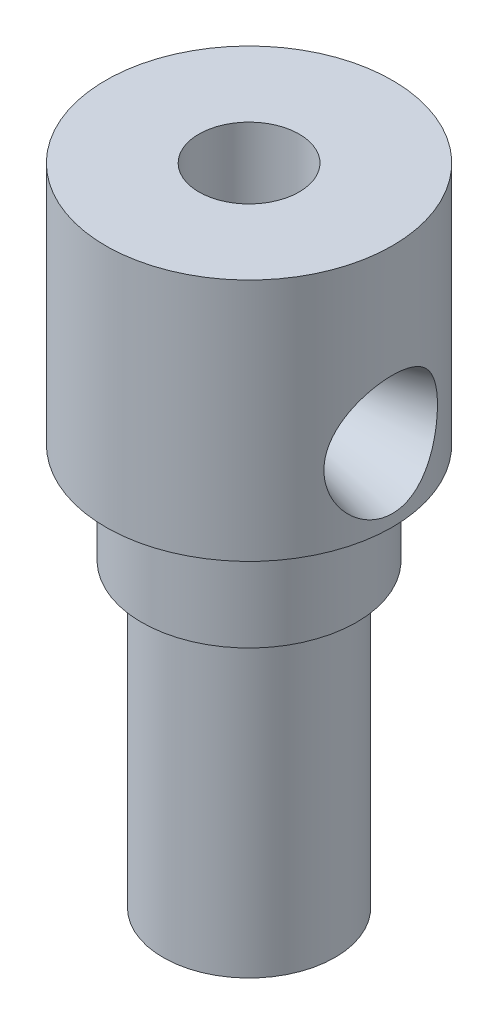
ISO-10303-21;
HEADER;
FILE_DESCRIPTION(('STEP AP214'),'2;1');
FILE_NAME('part.step','',(''),(''),'','','');
FILE_SCHEMA(('AUTOMOTIVE_DESIGN { 1 0 10303 214 1 1 1 1 }'));
ENDSEC;
DATA;
#1=APPLICATION_CONTEXT('core data for automotive mechanical design processes');
#2=APPLICATION_PROTOCOL_DEFINITION('international standard','automotive_design',2000,#1);
#3=PRODUCT_CONTEXT('',#1,'mechanical');
#4=PRODUCT('Part','Part','',(#3));
#5=PRODUCT_RELATED_PRODUCT_CATEGORY('part','',(#4));
#6=PRODUCT_DEFINITION_FORMATION('','',#4);
#7=PRODUCT_DEFINITION_CONTEXT('part definition',#1,'design');
#8=PRODUCT_DEFINITION('design','',#6,#7);
#9=PRODUCT_DEFINITION_SHAPE('','',#8);
#10=(LENGTH_UNIT() NAMED_UNIT(*) SI_UNIT(.MILLI.,.METRE.));
#11=(NAMED_UNIT(*) PLANE_ANGLE_UNIT() SI_UNIT($,.RADIAN.));
#12=(NAMED_UNIT(*) SI_UNIT($,.STERADIAN.) SOLID_ANGLE_UNIT());
#13=UNCERTAINTY_MEASURE_WITH_UNIT(LENGTH_MEASURE(1.E-05),#10,'distance_accuracy_value','');
#14=(GEOMETRIC_REPRESENTATION_CONTEXT(3) GLOBAL_UNCERTAINTY_ASSIGNED_CONTEXT((#13)) GLOBAL_UNIT_ASSIGNED_CONTEXT((#10,
#11,#12)) REPRESENTATION_CONTEXT('',''));
#15=CARTESIAN_POINT('',(0.,0.,0.));
#16=DIRECTION('',(0.,0.,1.));
#17=DIRECTION('',(1.,0.,0.));
#18=AXIS2_PLACEMENT_3D('',#15,#16,#17);
#19=CARTESIAN_POINT('',(3.43024899888577E-12,-1000.,0.));
#20=DIRECTION('',(0.,-1.,0.));
#21=DIRECTION('',(1.,0.,0.));
#22=AXIS2_PLACEMENT_3D('',#19,#20,#21);
#23=CYLINDRICAL_SURFACE('',#22,3.50000000000007);
#24=CARTESIAN_POINT('',(-1.54361204949859E-13,44.9999999999999,0.));
#25=DIRECTION('',(0.,-1.,0.));
#26=DIRECTION('',(1.,0.,0.));
#27=AXIS2_PLACEMENT_3D('',#24,#25,#26);
#28=CIRCLE('',#27,3.50000000000015);
#29=CARTESIAN_POINT('',(3.49999999999999,44.9999999999999,0.));
#30=VERTEX_POINT('',#29);
#31=EDGE_CURVE('E146',#30,#30,#28,.T.);
#32=ORIENTED_EDGE('',*,*,#31,.F.);
#33=EDGE_LOOP('',(#32));
#34=FACE_BOUND('',#33,.T.);
#35=CARTESIAN_POINT('',(0.,0.,0.));
#36=DIRECTION('',(0.,-1.,0.));
#37=DIRECTION('',(1.,0.,0.));
#38=AXIS2_PLACEMENT_3D('',#35,#36,#37);
#39=CIRCLE('',#38,3.5);
#40=CARTESIAN_POINT('',(3.5,0.,0.));
#41=VERTEX_POINT('',#40);
#42=EDGE_CURVE('E150',#41,#41,#39,.T.);
#43=ORIENTED_EDGE('',*,*,#42,.T.);
#44=EDGE_LOOP('',(#43));
#45=FACE_BOUND('',#44,.T.);
#46=CARTESIAN_POINT('',(-3.16227766016858,32.9999999999999,1.5));
#47=CARTESIAN_POINT('',(-3.16228717298635,33.0797689330453,1.49999038492545));
#48=CARTESIAN_POINT('',(-3.16534018013094,33.1596581416418,1.49359660659694));
#49=CARTESIAN_POINT('',(-3.17716042981284,33.3171166630736,1.46827542593982));
#50=CARTESIAN_POINT('',(-3.18594276667944,33.3946792801385,1.44931491353816));
#51=CARTESIAN_POINT('',(-3.20802619745341,33.5449159417977,1.39974825661799));
#52=CARTESIAN_POINT('',(-3.22130811955273,33.6176091853443,1.3691914561727));
#53=CARTESIAN_POINT('',(-3.25086693275577,33.7568179294356,1.29744502147729));
#54=CARTESIAN_POINT('',(-3.26714323581262,33.8233346390967,1.25625747429105));
#55=CARTESIAN_POINT('',(-3.3020556513053,33.9527249156165,1.16151711863134));
#56=CARTESIAN_POINT('',(-3.32077467653257,34.0151427308153,1.10737213961854));
#57=CARTESIAN_POINT('',(-3.35778390832709,34.1303513324004,0.989495816865006));
#58=CARTESIAN_POINT('',(-3.37607394135696,34.1831382794711,0.925760668427735));
#59=CARTESIAN_POINT('',(-3.4111822205103,34.2799595046357,0.786887444118557));
#60=CARTESIAN_POINT('',(-3.4278929336735,34.3234745951305,0.711357726755069));
#61=CARTESIAN_POINT('',(-3.45693710877249,34.3969821142158,0.553203581147165));
#62=CARTESIAN_POINT('',(-3.46927262014766,34.4269808759325,0.470582497238456));
#63=CARTESIAN_POINT('',(-3.48758735586731,34.470932510561,0.305382130945828));
#64=CARTESIAN_POINT('',(-3.49387724164591,34.4856730324828,0.223047558846189));
#65=CARTESIAN_POINT('',(-3.50052462942374,34.5012413503943,0.0568497000057583));
#66=CARTESIAN_POINT('',(-3.50088468598087,34.5020751373781,-0.0270129128697458));
#67=CARTESIAN_POINT('',(-3.49581016618052,34.4902048756097,-0.188134207596871));
#68=CARTESIAN_POINT('',(-3.49074679776848,34.4783681000254,-0.265470719086091));
#69=CARTESIAN_POINT('',(-3.47591102813465,34.4429879656725,-0.416935858912365));
#70=CARTESIAN_POINT('',(-3.46613827891667,34.4194437417866,-0.491064249746498));
#71=CARTESIAN_POINT('',(-3.44263346664983,34.3610467051371,-0.635378985342391));
#72=CARTESIAN_POINT('',(-3.42884310391325,34.3260263538251,-0.705487647304969));
#73=CARTESIAN_POINT('',(-3.39863837501715,34.2458413223221,-0.839017665141777));
#74=CARTESIAN_POINT('',(-3.38222306678453,34.2006729977342,-0.902436606512514));
#75=CARTESIAN_POINT('',(-3.34696895152083,34.097595246657,-1.02577392003805));
#76=CARTESIAN_POINT('',(-3.32804069559228,34.0389905651043,-1.08508648843663));
#77=CARTESIAN_POINT('',(-3.29078815665843,33.9126485841838,-1.19331308888252));
#78=CARTESIAN_POINT('',(-3.27246413723694,33.844907363126,-1.24222263226406));
#79=CARTESIAN_POINT('',(-3.23783417736962,33.6991100627387,-1.32993971380651));
#80=CARTESIAN_POINT('',(-3.22162619167375,33.6207679271549,-1.36831384702014));
#81=CARTESIAN_POINT('',(-3.19424697320001,33.4578554957209,-1.43107385954865));
#82=CARTESIAN_POINT('',(-3.18307189830862,33.3732900083394,-1.45547041320372));
#83=CARTESIAN_POINT('',(-3.16799275229824,33.2064136022164,-1.48799335058118));
#84=CARTESIAN_POINT('',(-3.16364898851218,33.1243355097023,-1.49710640039855));
#85=CARTESIAN_POINT('',(-3.16146494308536,32.9597255124398,-1.50171565988816));
#86=CARTESIAN_POINT('',(-3.16362218505086,32.8771937924446,-1.49721705457354));
#87=CARTESIAN_POINT('',(-3.1737407157785,32.7200687131297,-1.47563239208818));
#88=CARTESIAN_POINT('',(-3.18128847435221,32.6453221298145,-1.45944230541441));
#89=CARTESIAN_POINT('',(-3.20079786500729,32.4996772618146,-1.41614006363835));
#90=CARTESIAN_POINT('',(-3.21276056926771,32.4287799167272,-1.38902525529709));
#91=CARTESIAN_POINT('',(-3.24038333624207,32.2893950548549,-1.32334189052693));
#92=CARTESIAN_POINT('',(-3.25618154123665,32.2211463390906,-1.28432659707742));
#93=CARTESIAN_POINT('',(-3.28950916992067,32.0918246472426,-1.19638562157086));
#94=CARTESIAN_POINT('',(-3.30703937060589,32.0307549188947,-1.14745548114547));
#95=CARTESIAN_POINT('',(-3.34369698282849,31.9119855372203,-1.03605747720158));
#96=CARTESIAN_POINT('',(-3.36283055507232,31.8550423814142,-0.97278180241917));
#97=CARTESIAN_POINT('',(-3.39913473749093,31.7524328813364,-0.837142334524675));
#98=CARTESIAN_POINT('',(-3.4163051509707,31.7067676665061,-0.764777632276171));
#99=CARTESIAN_POINT('',(-3.44690719585074,31.6279586551947,-0.61229039367259));
#100=CARTESIAN_POINT('',(-3.46032004460402,31.594877477224,-0.532131490582577));
#101=CARTESIAN_POINT('',(-3.48173830246718,31.5429251005543,-0.366659881518579));
#102=CARTESIAN_POINT('',(-3.48974713693781,31.5240448996244,-0.281350477650408));
#103=CARTESIAN_POINT('',(-3.49904040628006,31.5022112711926,-0.11474019183488));
#104=CARTESIAN_POINT('',(-3.5007741852425,31.4981930943222,-0.0336030421543017));
#105=CARTESIAN_POINT('',(-3.49858700907243,31.503297754789,0.128169808807153));
#106=CARTESIAN_POINT('',(-3.4946671500199,31.5124180449498,0.208805604242761));
#107=CARTESIAN_POINT('',(-3.48185611932817,31.542776768471,0.364022405138262));
#108=CARTESIAN_POINT('',(-3.47316550610225,31.5635269837097,0.438716867066032));
#109=CARTESIAN_POINT('',(-3.45179100848839,31.6160080319217,0.583524431853928));
#110=CARTESIAN_POINT('',(-3.43910638916082,31.6477408859239,0.653636688669976));
#111=CARTESIAN_POINT('',(-3.410240472701,31.7228951779119,0.790820855389586));
#112=CARTESIAN_POINT('',(-3.39392604407196,31.7667838526131,0.857608099366125));
#113=CARTESIAN_POINT('',(-3.35970811620754,31.8643399647291,0.983159576175436));
#114=CARTESIAN_POINT('',(-3.34180398968819,31.9180112711777,1.04192061850001));
#115=CARTESIAN_POINT('',(-3.30477972078042,32.0381955086093,1.15419921481672));
#116=CARTESIAN_POINT('',(-3.28566570654999,32.1053580081201,1.20702595263292));
#117=CARTESIAN_POINT('',(-3.24969238680842,32.2481592575421,1.30078077887624));
#118=CARTESIAN_POINT('',(-3.23283439654761,32.3238029051032,1.34170194259387));
#119=CARTESIAN_POINT('',(-3.20355631016107,32.4815735699152,1.41018371094568));
#120=CARTESIAN_POINT('',(-3.19112824877822,32.563688623135,1.43776832759537));
#121=CARTESIAN_POINT('',(-3.17252771438411,32.7319551799154,1.47837340972957));
#122=CARTESIAN_POINT('',(-3.16633426473133,32.8180921209532,1.49144272805065));
#123=CARTESIAN_POINT('',(-3.16275406284923,32.9363988449216,1.49899243118201));
#124=CARTESIAN_POINT('',(-3.16227386666072,32.9681898590903,1.50000383428566));
#125=CARTESIAN_POINT('',(-3.16227766016858,32.9999999999999,1.5));
#126=B_SPLINE_CURVE_WITH_KNOTS('',3,(#46,#47,#48,#49,#50,#51,#52,#53,#54,#55,#56,#57,#58,#59,
#60,#61,#62,#63,#64,#65,#66,#67,#68,#69,#70,#71,#72,#73,#74,#75,#76,#77,#78,#79,#80,#81,#82,#83,
#84,#85,#86,#87,#88,#89,#90,#91,#92,#93,#94,#95,#96,#97,#98,#99,#100,#101,#102,#103,#104,#105,
#106,#107,#108,#109,#110,#111,#112,#113,#114,#115,#116,#117,#118,#119,#120,#121,#122,#123,#124,
#125),.UNSPECIFIED.,.T.,.F.,(4,2,2,2,2,2,2,2,2,2,2,2,2,2,2,2,2,2,2,2,2,2,2,2,2,2,2,2,2,2,2,2,2,
2,2,2,2,2,2,4),(0.,0.239211516998634,0.479055812925293,0.717890772651929,0.956678879115822,
1.20974703533054,1.46291585698785,1.72782087173741,1.992601634844,2.24290515697656,
2.49310084605822,2.72720452587285,2.96132550725882,3.19902917219044,3.43681833943188,
3.69219429883402,3.94768022455396,4.21248245374586,4.47708218938959,4.72382987542101,
4.97048358104408,5.20000580849602,5.42958381263239,5.66914358774548,5.9088113247203,
6.16934837221379,6.4299115008954,6.69175474679388,6.95343186577332,7.19595274449671,
7.43842661162275,7.67141114258535,7.90443857025996,8.14809791325949,8.39185383353303,
8.65331392763673,8.91492579368384,9.17606486564866,9.43632235654434,9.53171478279883),.UNSPECIFIED.);
#127=CARTESIAN_POINT('',(-3.16227766016858,32.9999999999999,1.5));
#128=VERTEX_POINT('',#127);
#129=EDGE_CURVE('E111',#128,#128,#126,.T.);
#130=ORIENTED_EDGE('',*,*,#129,.T.);
#131=EDGE_LOOP('',(#130));
#132=FACE_BOUND('',#131,.T.);
#133=CARTESIAN_POINT('',(3.3192983763002,30.8841175106406,-1.11007953938104));
#134=CARTESIAN_POINT('',(3.27505346496672,30.9669097046721,-1.24236284383979));
#135=CARTESIAN_POINT('',(3.22537822538103,31.0631788564267,-1.36447422967453));
#136=CARTESIAN_POINT('',(3.12233204935759,31.2773749153735,-1.58621630510902));
#137=CARTESIAN_POINT('',(3.06895243277781,31.3953538390581,-1.6857916928129));
#138=CARTESIAN_POINT('',(2.97309961821601,31.6311847745015,-1.84886746408532));
#139=CARTESIAN_POINT('',(2.93014899190375,31.7467160568075,-1.91547309135806));
#140=CARTESIAN_POINT('',(2.85182867222523,31.9889561575559,-2.03025044604157));
#141=CARTESIAN_POINT('',(2.81644818110413,32.1156486866604,-2.07844850743833));
#142=CARTESIAN_POINT('',(2.7722835169032,32.3142781012026,-2.13659949846228));
#143=CARTESIAN_POINT('',(2.75890175436112,32.3831546800821,-2.15378671818937));
#144=CARTESIAN_POINT('',(2.73609767265479,32.5226755584869,-2.18268434704547));
#145=CARTESIAN_POINT('',(2.72667316685131,32.5933188588577,-2.19439778119876));
#146=CARTESIAN_POINT('',(2.71227304057847,32.7357078787661,-2.21217278423635));
#147=CARTESIAN_POINT('',(2.70729370143494,32.8074526256589,-2.21823907750737));
#148=CARTESIAN_POINT('',(2.70203176096417,32.9513434353827,-2.22464265089909));
#149=CARTESIAN_POINT('',(2.70174839379945,33.0234894308565,-2.22498086517751));
#150=CARTESIAN_POINT('',(2.70739139390643,33.2176844792519,-2.21813167872549));
#151=CARTESIAN_POINT('',(2.7177823210355,33.3394766626775,-2.20553617554464));
#152=CARTESIAN_POINT('',(2.75068555204764,33.5785598268799,-2.16434472468984));
#153=CARTESIAN_POINT('',(2.77320440442646,33.695848339204,-2.13574013255137));
#154=CARTESIAN_POINT('',(2.82761418594652,33.9245788925513,-2.06316818687296));
#155=CARTESIAN_POINT('',(2.85959732860369,34.035950055298,-2.0190488316409));
#156=CARTESIAN_POINT('',(2.92937670940622,34.2499185182038,-1.91640280432009));
#157=CARTESIAN_POINT('',(2.9671775079044,34.3525088361908,-1.85786480792196));
#158=CARTESIAN_POINT('',(3.0514460334929,34.5631212197476,-1.71653290442782));
#159=CARTESIAN_POINT('',(3.0983329948491,34.6693878602498,-1.63135698908882));
#160=CARTESIAN_POINT('',(3.19032736522379,34.8657023303444,-1.4431756435287));
#161=CARTESIAN_POINT('',(3.23543593077023,34.955760840972,-1.34018204345528));
#162=CARTESIAN_POINT('',(3.31090260355411,35.1008457242358,-1.13892524357798));
#163=CARTESIAN_POINT('',(3.34242907604321,35.1592784870864,-1.04356189235897));
#164=CARTESIAN_POINT('',(3.39849765767729,35.2611174655438,-0.843209640457221));
#165=CARTESIAN_POINT('',(3.42304541360129,35.304535836131,-0.738228613325954));
#166=CARTESIAN_POINT('',(3.46292622037568,35.3743003226936,-0.520101644633127));
#167=CARTESIAN_POINT('',(3.47818993404226,35.4005180886615,-0.406901166714734));
#168=CARTESIAN_POINT('',(3.49743428614585,35.4334857847369,-0.176765517525658));
#169=CARTESIAN_POINT('',(3.50142280225968,35.4402493070582,-0.0598330115157757));
#170=CARTESIAN_POINT('',(3.49788969502934,35.434224010738,0.158924363695666));
#171=CARTESIAN_POINT('',(3.49171879270816,35.4237298469002,0.260844451917433));
#172=CARTESIAN_POINT('',(3.47094579747389,35.3880426176246,0.461167878653256));
#173=CARTESIAN_POINT('',(3.45634304775973,35.3628484071209,0.559570942573585));
#174=CARTESIAN_POINT('',(3.41993652289223,35.2990143726478,0.750688336863922));
#175=CARTESIAN_POINT('',(3.39811678084937,35.2603447253371,0.843389508134491));
#176=CARTESIAN_POINT('',(3.34895123493292,35.1711961419319,1.02130167240327));
#177=CARTESIAN_POINT('',(3.32160363369051,35.1207133639853,1.10651021622878));
#178=CARTESIAN_POINT('',(3.25895938477956,35.0014788700073,1.28019132939464));
#179=CARTESIAN_POINT('',(3.22308514418955,34.9311426925934,1.36736391622159));
#180=CARTESIAN_POINT('',(3.14913945750675,34.7790010395908,1.53000621045079));
#181=CARTESIAN_POINT('',(3.1110661552386,34.6971857890328,1.60546582713612));
#182=CARTESIAN_POINT('',(3.02841726728773,34.5075202796342,1.75711579512896));
#183=CARTESIAN_POINT('',(2.98394438341448,34.3976551111006,1.8308495374898));
#184=CARTESIAN_POINT('',(2.90037368917721,34.1658125062234,1.96056192035597));
#185=CARTESIAN_POINT('',(2.86127956874326,34.0438268528339,2.0165284062717));
#186=CARTESIAN_POINT('',(2.80947517717637,33.8499470393607,2.08752773767339));
#187=CARTESIAN_POINT('',(2.79300752395133,33.7815009097775,2.10942835384735));
#188=CARTESIAN_POINT('',(2.76369616470761,33.6423344658172,2.14768852470571));
#189=CARTESIAN_POINT('',(2.75085052197468,33.5716153894226,2.16405104159188));
#190=CARTESIAN_POINT('',(2.7294263633711,33.4285610690207,2.19101098510175));
#191=CARTESIAN_POINT('',(2.72084137375665,33.3562284525101,2.20161716036524));
#192=CARTESIAN_POINT('',(2.70837550783869,33.2105445420758,2.216935097979));
#193=CARTESIAN_POINT('',(2.70449364467968,33.1371934651238,2.22164809689922));
#194=CARTESIAN_POINT('',(2.70185879863079,33.0008161779693,2.22485094074478));
#195=CARTESIAN_POINT('',(2.7024493137013,32.937820000474,2.22413729567477));
#196=CARTESIAN_POINT('',(2.70720420678837,32.8121582921319,2.21834498215044));
#197=CARTESIAN_POINT('',(2.71136972271485,32.7494928729548,2.21326492388172));
#198=CARTESIAN_POINT('',(2.72901427632999,32.562736645282,2.19154473493952));
#199=CARTESIAN_POINT('',(2.74764002019326,32.4398019083062,2.16842644054472));
#200=CARTESIAN_POINT('',(2.79488692396682,32.2052516605105,2.10713208122375));
#201=CARTESIAN_POINT('',(2.82309015635378,32.0933817174276,2.06957810316109));
#202=CARTESIAN_POINT('',(2.88637376135268,31.8774595298289,1.98036285574231));
#203=CARTESIAN_POINT('',(2.92145841521408,31.773412208158,1.92869279621851));
#204=CARTESIAN_POINT('',(3.00099753701529,31.5590977582172,1.80287909029898));
#205=CARTESIAN_POINT('',(3.04606123832951,31.4503693833212,1.72649264684774));
#206=CARTESIAN_POINT('',(3.13631357294204,31.2473085383847,1.5565306098279));
#207=CARTESIAN_POINT('',(3.18150218033689,31.1529732825904,1.46295835027892));
#208=CARTESIAN_POINT('',(3.26167196941734,30.9929563249916,1.27304710196135));
#209=CARTESIAN_POINT('',(3.29720956949888,30.925128983973,1.17875859955244));
#210=CARTESIAN_POINT('',(3.36196068865574,30.804711813544,0.978890934246783));
#211=CARTESIAN_POINT('',(3.39117818926672,30.752112383746,0.8733189427298));
#212=CARTESIAN_POINT('',(3.4406275650663,30.6644344833796,0.651945195793201));
#213=CARTESIAN_POINT('',(3.46078022956555,30.6295101432329,0.536063473541947));
#214=CARTESIAN_POINT('',(3.48928044115922,30.5804015310008,0.298596226110519));
#215=CARTESIAN_POINT('',(3.49764070497621,30.5661949167142,0.177016991494987));
#216=CARTESIAN_POINT('',(3.50121327156326,30.5601129591646,-0.0491813259683404));
#217=CARTESIAN_POINT('',(3.49815466051463,30.5653009820694,-0.153706143666628));
#218=CARTESIAN_POINT('',(3.48296378615758,30.5912897335863,-0.360088791833983));
#219=CARTESIAN_POINT('',(3.47083265258459,30.6120885183046,-0.461946952728135));
#220=CARTESIAN_POINT('',(3.43882792965969,30.6677568336216,-0.659031091206708));
#221=CARTESIAN_POINT('',(3.419050032981,30.702452640771,-0.754322525807593));
#222=CARTESIAN_POINT('',(3.3733492190115,30.7843156927491,-0.937809991225607));
#223=CARTESIAN_POINT('',(3.347420710601,30.831494289396,-1.02599946783648));
#224=CARTESIAN_POINT('',(3.3192983763002,30.8841175106406,-1.11007953938104));
#225=B_SPLINE_CURVE_WITH_KNOTS('',3,(#133,#134,#135,#136,#137,#138,#139,#140,#141,#142,#143,
#144,#145,#146,#147,#148,#149,#150,#151,#152,#153,#154,#155,#156,#157,#158,#159,#160,#161,#162,
#163,#164,#165,#166,#167,#168,#169,#170,#171,#172,#173,#174,#175,#176,#177,#178,#179,#180,#181,
#182,#183,#184,#185,#186,#187,#188,#189,#190,#191,#192,#193,#194,#195,#196,#197,#198,#199,#200,
#201,#202,#203,#204,#205,#206,#207,#208,#209,#210,#211,#212,#213,#214,#215,#216,#217,#218,#219,
#220,#221,#222,#223,#224),.UNSPECIFIED.,.T.,.F.,(4,2,2,2,2,2,2,2,2,2,2,2,2,2,2,2,2,2,2,2,2,2,2,
2,2,2,2,2,2,2,2,2,2,2,2,2,2,2,2,2,2,2,2,2,2,4),(0.,0.486075422603255,0.973331013082581,
1.39198530136104,1.81003839627557,2.0264732383259,2.24278832829952,2.45892228643816,
2.67502099625875,3.04169838561825,3.40857396190326,3.77914892101136,4.15001586060454,
4.58019703745402,5.01009368177135,5.35731042607625,5.70424541754639,6.05374063281513,
6.40299160476931,6.70944004729179,7.01591236392029,7.32306730729061,7.63032228239565,
7.98186697313664,8.33371285834816,8.75076903815871,9.16810991456383,9.38901398894857,
9.60979971941362,9.83024894749222,10.0506519107648,10.2394026706023,10.4282135314194,
10.8055868748375,11.168250024081,11.5311395226029,11.9503198944257,12.3694190316881,
12.7323654902901,13.0950826296747,13.4609104726751,13.8263435108113,14.1388430593596,
14.4513037010827,14.7599745160804,15.0689270061603),.UNSPECIFIED.);
#226=CARTESIAN_POINT('',(3.3192983763002,30.8841175106406,-1.11007953938104));
#227=VERTEX_POINT('',#226);
#228=EDGE_CURVE('E215',#227,#227,#225,.T.);
#229=ORIENTED_EDGE('',*,*,#228,.T.);
#230=EDGE_LOOP('',(#229));
#231=FACE_BOUND('',#230,.T.);
#232=ADVANCED_FACE('F39',(#34,#45,#132,#231),#23,.F.);
#233=CARTESIAN_POINT('',(3.43024899888577E-12,-1000.,0.));
#234=DIRECTION('',(0.,-1.,0.));
#235=DIRECTION('',(1.,0.,0.));
#236=AXIS2_PLACEMENT_3D('',#233,#234,#235);
#237=CYLINDRICAL_SURFACE('',#236,10.0000000000001);
#238=CARTESIAN_POINT('',(-9.79795897113297,39.9999999999999,2.));
#239=CARTESIAN_POINT('',(-9.79795611157865,40.0556671372986,2.00000029709046));
#240=CARTESIAN_POINT('',(-9.79843398465458,40.1113070388049,1.99767440405642));
#241=CARTESIAN_POINT('',(-9.80032138150159,40.2221774356675,1.98839986829158));
#242=CARTESIAN_POINT('',(-9.80173079002224,40.2774079808151,1.98145179742019));
#243=CARTESIAN_POINT('',(-9.80730283285177,40.4417098803015,1.95376239954903));
#244=CARTESIAN_POINT('',(-9.81280956758581,40.5496628575344,1.92617555297558));
#245=CARTESIAN_POINT('',(-9.82677660401707,40.7592851934838,1.85359362042638));
#246=CARTESIAN_POINT('',(-9.83523723174891,40.8609538571134,1.80859661275257));
#247=CARTESIAN_POINT('',(-9.85415440257684,41.0553297677597,1.7025082088197));
#248=CARTESIAN_POINT('',(-9.86461115250653,41.1480360846177,1.64141514447461));
#249=CARTESIAN_POINT('',(-9.88650550448331,41.32311967337,1.50396101869286));
#250=CARTESIAN_POINT('',(-9.89795377776191,41.4053525644587,1.42741780364327));
#251=CARTESIAN_POINT('',(-9.92044851228385,41.5559088785751,1.26162118198369));
#252=CARTESIAN_POINT('',(-9.93149491105278,41.6242301464609,1.17236580968335));
#253=CARTESIAN_POINT('',(-9.95205620855108,41.7455778018474,0.982720106800586));
#254=CARTESIAN_POINT('',(-9.96155694564041,41.7984659384245,0.88223964954998));
#255=CARTESIAN_POINT('',(-9.97783510909022,41.8865517690995,0.673602404217793));
#256=CARTESIAN_POINT('',(-9.98461293824447,41.9217520799117,0.565446754297825));
#257=CARTESIAN_POINT('',(-9.99460635554011,41.9730140969378,0.346034817774202));
#258=CARTESIAN_POINT('',(-9.99786765043103,41.9893215789677,0.234838069151993));
#259=CARTESIAN_POINT('',(-10.0006184349227,42.0031019588767,0.0112397534982613));
#260=CARTESIAN_POINT('',(-10.0001082004813,42.0005762347568,-0.101161724783848));
#261=CARTESIAN_POINT('',(-9.99540868887671,41.9769475992567,-0.322284405513385));
#262=CARTESIAN_POINT('',(-9.99127193663447,41.9561099001904,-0.431035226714461));
#263=CARTESIAN_POINT('',(-9.97984349003543,41.8968696460478,-0.643464013108169));
#264=CARTESIAN_POINT('',(-9.97255169250428,41.8584665165554,-0.747141812282547));
#265=CARTESIAN_POINT('',(-9.95554578241078,41.7649391930092,-0.94724054262592));
#266=CARTESIAN_POINT('',(-9.94581664782219,41.709710826148,-1.04361145363295));
#267=CARTESIAN_POINT('',(-9.92500903258372,41.5841794594466,-1.22581287576612));
#268=CARTESIAN_POINT('',(-9.91393044014112,41.5138752103124,-1.31164251244037));
#269=CARTESIAN_POINT('',(-9.89142074737036,41.3587432767495,-1.47189241307715));
#270=CARTESIAN_POINT('',(-9.87998686483506,41.2736851958568,-1.54608938999208));
#271=CARTESIAN_POINT('',(-9.85823412232874,41.0921904830222,-1.67922179979889));
#272=CARTESIAN_POINT('',(-9.84791557170842,40.9957507096674,-1.73815300484306));
#273=CARTESIAN_POINT('',(-9.82955460084669,40.7938951901081,-1.83915990928954));
#274=CARTESIAN_POINT('',(-9.82151838996717,40.6884559532068,-1.881189753269));
#275=CARTESIAN_POINT('',(-9.80872322125014,40.4718827374886,-1.94681419465982));
#276=CARTESIAN_POINT('',(-9.80395938256601,40.3607575067037,-1.97043625496866));
#277=CARTESIAN_POINT('',(-9.80006354383953,40.2072863663071,-1.98966587624393));
#278=CARTESIAN_POINT('',(-9.79927519744012,40.165891720435,-1.99354251131102));
#279=CARTESIAN_POINT('',(-9.7982233477357,40.0830042717251,-1.9987063293293));
#280=CARTESIAN_POINT('',(-9.79795896609676,40.0415117500884,-1.99999784580931));
#281=CARTESIAN_POINT('',(-9.79795897113298,39.9999999999999,-2.));
#282=B_SPLINE_CURVE_WITH_KNOTS('',3,(#238,#239,#240,#241,#242,#243,#244,#245,#246,#247,#248,
#249,#250,#251,#252,#253,#254,#255,#256,#257,#258,#259,#260,#261,#262,#263,#264,#265,#266,#267,
#268,#269,#270,#271,#272,#273,#274,#275,#276,#277,#278,#279,#280,#281),.UNSPECIFIED.,.F.,.F.,(4,
2,2,2,2,2,2,2,2,2,2,2,2,2,2,2,2,2,2,2,2,4),(0.,0.166897020715845,0.33377339664307,
0.666722601037227,0.999708566174139,1.33272905329863,1.66993288931439,2.00718892413592,
2.34737937755194,2.68751948879678,3.02318320738907,3.35882236614862,3.68967912555437,
4.0205467052512,4.35350597112352,4.68649283901807,5.02524540329292,5.36409168485659,
5.70385119298727,6.04310283225105,6.16778801087552,6.29226399953897),.UNSPECIFIED.);
#283=CARTESIAN_POINT('',(-9.79795897113299,39.9999999999999,2.));
#284=VERTEX_POINT('',#283);
#285=CARTESIAN_POINT('',(-9.79795897113294,39.9999999999999,-2.));
#286=VERTEX_POINT('',#285);
#287=EDGE_CURVE('E53',#284,#286,#282,.T.);
#288=ORIENTED_EDGE('',*,*,#287,.F.);
#289=DIRECTION('',(0.,-1.,0.));
#290=VECTOR('',#289,1.);
#291=CARTESIAN_POINT('',(-9.79795897112944,-1000.,1.99999999999987));
#292=LINE('',#291,#290);
#293=CARTESIAN_POINT('',(-9.79795897113298,32.9999999999999,1.99999999999987));
#294=VERTEX_POINT('',#293);
#295=EDGE_CURVE('E88',#294,#284,#292,.F.);
#296=ORIENTED_EDGE('',*,*,#295,.F.);
#297=CARTESIAN_POINT('',(-9.79795897113295,32.9999999999999,-2.));
#298=CARTESIAN_POINT('',(-9.79795611157862,32.9443328627012,-2.00000029709046));
#299=CARTESIAN_POINT('',(-9.79843398465455,32.888692961195,-1.99767440405642));
#300=CARTESIAN_POINT('',(-9.80032138150156,32.7778225643324,-1.98839986829158));
#301=CARTESIAN_POINT('',(-9.80173079002221,32.7225920191847,-1.98145179742019));
#302=CARTESIAN_POINT('',(-9.80730283285174,32.5582901196984,-1.95376239954903));
#303=CARTESIAN_POINT('',(-9.81280956758578,32.4503371424655,-1.92617555297558));
#304=CARTESIAN_POINT('',(-9.82677660401704,32.240714806516,-1.85359362042638));
#305=CARTESIAN_POINT('',(-9.83523723174888,32.1390461428865,-1.80859661275257));
#306=CARTESIAN_POINT('',(-9.85415440257681,31.9446702322402,-1.7025082088197));
#307=CARTESIAN_POINT('',(-9.8646111525065,31.8519639153822,-1.64141514447461));
#308=CARTESIAN_POINT('',(-9.88650550448328,31.6768803266299,-1.50396101869285));
#309=CARTESIAN_POINT('',(-9.89795377776188,31.5946474355412,-1.42741780364326));
#310=CARTESIAN_POINT('',(-9.92044851228382,31.4440911214248,-1.26162118198369));
#311=CARTESIAN_POINT('',(-9.93149491105275,31.375769853539,-1.17236580968335));
#312=CARTESIAN_POINT('',(-9.95205620855105,31.2544221981525,-0.982720106800588));
#313=CARTESIAN_POINT('',(-9.96155694564037,31.2015340615753,-0.882239649549983));
#314=CARTESIAN_POINT('',(-9.97783510909018,31.1134482309004,-0.673602404217794));
#315=CARTESIAN_POINT('',(-9.98461293824443,31.0782479200881,-0.565446754297824));
#316=CARTESIAN_POINT('',(-9.99460635554007,31.0269859030621,-0.346034817774199));
#317=CARTESIAN_POINT('',(-9.99786765043099,31.0106784210321,-0.234838069151991));
#318=CARTESIAN_POINT('',(-10.0006184349226,30.9968980411231,-0.0112397534982601));
#319=CARTESIAN_POINT('',(-10.0001082004812,30.9994237652431,0.101161724783849));
#320=CARTESIAN_POINT('',(-9.99540868887667,31.0230524007431,0.322284405513386));
#321=CARTESIAN_POINT('',(-9.99127193663443,31.0438900998095,0.431035226714462));
#322=CARTESIAN_POINT('',(-9.97984349003539,31.103130353952,0.64346401310817));
#323=CARTESIAN_POINT('',(-9.97255169250425,31.1415334834444,0.747141812282549));
#324=CARTESIAN_POINT('',(-9.95554578241074,31.2350608069906,0.94724054262592));
#325=CARTESIAN_POINT('',(-9.94581664782216,31.2902891738518,1.04361145363294));
#326=CARTESIAN_POINT('',(-9.92500903258368,31.4158205405533,1.22581287576612));
#327=CARTESIAN_POINT('',(-9.91393044014109,31.4861247896874,1.31164251244036));
#328=CARTESIAN_POINT('',(-9.89142074737033,31.6412567232504,1.47189241307715));
#329=CARTESIAN_POINT('',(-9.87998686483503,31.7263148041431,1.54608938999208));
#330=CARTESIAN_POINT('',(-9.85823412232871,31.9078095169777,1.6792217997989));
#331=CARTESIAN_POINT('',(-9.84791557170838,32.0042492903324,1.73815300484306));
#332=CARTESIAN_POINT('',(-9.82955460084666,32.2061048098918,1.83915990928954));
#333=CARTESIAN_POINT('',(-9.82151838996714,32.3115440467931,1.881189753269));
#334=CARTESIAN_POINT('',(-9.80872322125011,32.5281172625113,1.94681419465982));
#335=CARTESIAN_POINT('',(-9.80395938256598,32.6392424932962,1.97043625496866));
#336=CARTESIAN_POINT('',(-9.8000635438395,32.7927136336928,1.98966587624393));
#337=CARTESIAN_POINT('',(-9.7992751974401,32.8341082795648,1.99354251131102));
#338=CARTESIAN_POINT('',(-9.79822334773568,32.9169957282748,1.9987063293293));
#339=CARTESIAN_POINT('',(-9.79795896609673,32.9584882499115,1.99999784580931));
#340=CARTESIAN_POINT('',(-9.79795897113295,32.9999999999999,2.));
#341=B_SPLINE_CURVE_WITH_KNOTS('',3,(#297,#298,#299,#300,#301,#302,#303,#304,#305,#306,#307,
#308,#309,#310,#311,#312,#313,#314,#315,#316,#317,#318,#319,#320,#321,#322,#323,#324,#325,#326,
#327,#328,#329,#330,#331,#332,#333,#334,#335,#336,#337,#338,#339,#340),.UNSPECIFIED.,.F.,.F.,(4,
2,2,2,2,2,2,2,2,2,2,2,2,2,2,2,2,2,2,2,2,4),(0.,0.166897020715838,0.333773396643063,
0.666722601037227,0.999708566174147,1.33272905329864,1.66993288931439,2.00718892413591,
2.34737937755193,2.68751948879678,3.02318320738907,3.35882236614862,3.68967912555437,
4.0205467052512,4.35350597112352,4.68649283901807,5.02524540329292,5.3640916848566,
5.70385119298728,6.04310283225105,6.16778801087553,6.29226399953897),.UNSPECIFIED.);
#342=CARTESIAN_POINT('',(-9.79795897113295,32.9999999999999,-2.));
#343=VERTEX_POINT('',#342);
#344=EDGE_CURVE('E160',#343,#294,#341,.T.);
#345=ORIENTED_EDGE('',*,*,#344,.F.);
#346=DIRECTION('',(0.,-1.,0.));
#347=VECTOR('',#346,1.);
#348=CARTESIAN_POINT('',(-9.79795897112938,-1000.,-2.00000000000013));
#349=LINE('',#348,#347);
#350=EDGE_CURVE('E168',#343,#286,#349,.F.);
#351=ORIENTED_EDGE('',*,*,#350,.T.);
#352=EDGE_LOOP('',(#288,#296,#345,#351));
#353=FACE_BOUND('',#352,.T.);
#354=CARTESIAN_POINT('',(-1.54361204949859E-13,44.9999999999999,0.));
#355=DIRECTION('',(0.,-1.,0.));
#356=DIRECTION('',(1.,0.,0.));
#357=AXIS2_PLACEMENT_3D('',#354,#355,#356);
#358=CIRCLE('',#357,10.0000000000002);
#359=CARTESIAN_POINT('',(10.,45.,0.));
#360=VERTEX_POINT('',#359);
#361=EDGE_CURVE('E142',#360,#360,#358,.T.);
#362=ORIENTED_EDGE('',*,*,#361,.T.);
#363=EDGE_LOOP('',(#362));
#364=FACE_BOUND('',#363,.T.);
#365=CARTESIAN_POINT('',(0.,28.,0.));
#366=DIRECTION('',(0.,-1.,0.));
#367=DIRECTION('',(1.,0.,0.));
#368=AXIS2_PLACEMENT_3D('',#365,#366,#367);
#369=CIRCLE('',#368,10.0000000000001);
#370=CARTESIAN_POINT('',(10.,28.0000000000001,0.));
#371=VERTEX_POINT('',#370);
#372=EDGE_CURVE('E138',#371,#371,#369,.T.);
#373=ORIENTED_EDGE('',*,*,#372,.F.);
#374=EDGE_LOOP('',(#373));
#375=FACE_BOUND('',#374,.T.);
#376=CARTESIAN_POINT('',(9.54456843983206,30.2501339068279,-2.98349012020526));
#377=CARTESIAN_POINT('',(9.58951061092701,30.0763867431767,-2.8397094155826));
#378=CARTESIAN_POINT('',(9.63538074171052,29.9143529751777,-2.68153511685761));
#379=CARTESIAN_POINT('',(9.72413159146345,29.6185243766645,-2.33934949778133));
#380=CARTESIAN_POINT('',(9.7670048651959,29.4847983111055,-2.15527702937182));
#381=CARTESIAN_POINT('',(9.84507683220518,29.250254468994,-1.76470402030351));
#382=CARTESIAN_POINT('',(9.88024903649383,29.1495497011209,-1.55812961848728));
#383=CARTESIAN_POINT('',(9.93842326590006,28.9864517035346,-1.12891868596273));
#384=CARTESIAN_POINT('',(9.96144089657495,28.9240093311721,-0.906303170469646));
#385=CARTESIAN_POINT('',(9.99099522346315,28.8443790294583,-0.472349400746434));
#386=CARTESIAN_POINT('',(9.99880119729373,28.8236999706012,-0.261736419165794));
#387=CARTESIAN_POINT('',(10.0009401887979,28.8180042694789,0.160028432605219));
#388=CARTESIAN_POINT('',(9.99527634400623,28.8329793222761,0.371180165859232));
#389=CARTESIAN_POINT('',(9.97185469453642,28.8958792814485,0.775037966651446));
#390=CARTESIAN_POINT('',(9.95482339828467,28.9418263831189,0.968100673627747));
#391=CARTESIAN_POINT('',(9.91110975113514,29.0626348580793,1.3437600733627));
#392=CARTESIAN_POINT('',(9.88442620186203,29.1374998217445,1.52635546328928));
#393=CARTESIAN_POINT('',(9.82263268365223,29.3169914129114,1.88419939367774));
#394=CARTESIAN_POINT('',(9.78722531772974,29.4227001921799,2.05885125670585));
#395=CARTESIAN_POINT('',(9.71186817432401,29.6591043362764,2.38922170060206));
#396=CARTESIAN_POINT('',(9.67191652552836,29.7898100099036,2.54493242658767));
#397=CARTESIAN_POINT('',(9.58703166427064,30.086490396202,2.84887206529293));
#398=CARTESIAN_POINT('',(9.54198880178109,30.2546478064917,2.99494234113052));
#399=CARTESIAN_POINT('',(9.45515989371881,30.6126981280437,3.25872390213982));
#400=CARTESIAN_POINT('',(9.41337518057383,30.8025998541402,3.37642362583112));
#401=CARTESIAN_POINT('',(9.33504291130979,31.2121961347829,3.5875459377368));
#402=CARTESIAN_POINT('',(9.29898648955446,31.433011278638,3.67898923947346));
#403=CARTESIAN_POINT('',(9.24001379725119,31.8882297237328,3.82470773795476));
#404=CARTESIAN_POINT('',(9.21709393586636,32.1226292924046,3.8789930924947));
#405=CARTESIAN_POINT('',(9.18777802674207,32.5931782545976,3.94792760686685));
#406=CARTESIAN_POINT('',(9.1810455520814,32.8291878782101,3.9633840694511));
#407=CARTESIAN_POINT('',(9.18403133662697,33.3005236938207,3.95646131230706));
#408=CARTESIAN_POINT('',(9.19374753846625,33.535849967603,3.93408682439744));
#409=CARTESIAN_POINT('',(9.22779350322379,33.9918605776696,3.8535207094));
#410=CARTESIAN_POINT('',(9.25167949636704,34.2127722505201,3.79641546444173));
#411=CARTESIAN_POINT('',(9.31080868570502,34.6416126631713,3.64898798427101));
#412=CARTESIAN_POINT('',(9.3460546226209,34.8495382554599,3.55865773238825));
#413=CARTESIAN_POINT('',(9.42516499652512,35.2535508022941,3.34361167096323));
#414=CARTESIAN_POINT('',(9.46926254611303,35.4490716709537,3.21791756460646));
#415=CARTESIAN_POINT('',(9.56040205452971,35.8160650531827,2.93609455699748));
#416=CARTESIAN_POINT('',(9.60744489521747,35.9875303139026,2.77995651055616));
#417=CARTESIAN_POINT('',(9.70031790332666,36.3049898118848,2.43639308889839));
#418=CARTESIAN_POINT('',(9.74610018742391,36.450356499626,2.24836671521919));
#419=CARTESIAN_POINT('',(9.80890578897205,36.6415628370644,1.94830285827274));
#420=CARTESIAN_POINT('',(9.82886994756571,36.7008429878712,1.84523190282708));
#421=CARTESIAN_POINT('',(9.86622684877609,36.8098353731699,1.63372803031042));
#422=CARTESIAN_POINT('',(9.8836210107657,36.8595528935812,1.52529811741039));
#423=CARTESIAN_POINT('',(9.91419657501983,36.945794335006,1.31133270481645));
#424=CARTESIAN_POINT('',(9.92758258615563,36.9829805602423,1.20609273081199));
#425=CARTESIAN_POINT('',(9.95120775485446,37.0480221520606,0.992473752934544));
#426=CARTESIAN_POINT('',(9.96144850674596,37.0758822466941,0.884096369999224));
#427=CARTESIAN_POINT('',(9.97846346492299,37.1219096105524,0.66506811460059));
#428=CARTESIAN_POINT('',(9.98523904095788,37.1400807098614,0.554418158481574));
#429=CARTESIAN_POINT('',(9.9951161268921,37.1664968648049,0.331813956102138));
#430=CARTESIAN_POINT('',(9.99821793654154,37.1747427302606,0.219859817005475));
#431=CARTESIAN_POINT('',(10.0015935164302,37.1837451455559,-0.0950971250031983));
#432=CARTESIAN_POINT('',(9.99756000235499,37.1730744162513,-0.298608864814908));
#433=CARTESIAN_POINT('',(9.97746771981771,37.119242708281,-0.700524503100627));
#434=CARTESIAN_POINT('',(9.96140973568454,37.0760838487414,-0.898928733852801));
#435=CARTESIAN_POINT('',(9.91928705297276,36.9601660495262,-1.28233320862139));
#436=CARTESIAN_POINT('',(9.89338065084653,36.8878743198002,-1.46749308740513));
#437=CARTESIAN_POINT('',(9.83398381922314,36.7164381232409,-1.82356921817735));
#438=CARTESIAN_POINT('',(9.80049144115425,36.6172867558218,-1.99448179507446));
#439=CARTESIAN_POINT('',(9.72615563987745,36.3868753626788,-2.33104815211856));
#440=CARTESIAN_POINT('',(9.68495014072443,36.2537712472654,-2.49535744481291));
#441=CARTESIAN_POINT('',(9.601001475379,35.9638264042435,-2.80106307403697));
#442=CARTESIAN_POINT('',(9.55825755798416,35.8069739572031,-2.94244802602524));
#443=CARTESIAN_POINT('',(9.47128485721076,35.4576910537344,-3.21195506588618));
#444=CARTESIAN_POINT('',(9.42728581667649,35.2633103146792,-3.33763223985382));
#445=CARTESIAN_POINT('',(9.34701266893113,34.8554452368495,-3.55625754668649));
#446=CARTESIAN_POINT('',(9.31073966589311,34.6419581736624,-3.64920100262378));
#447=CARTESIAN_POINT('',(9.24946117510368,34.1957963737377,-3.80190306915601));
#448=CARTESIAN_POINT('',(9.22475651774678,33.9627776879722,-3.8607841734835));
#449=CARTESIAN_POINT('',(9.19129433986329,33.4892092895903,-3.93979726372695));
#450=CARTESIAN_POINT('',(9.18252922435467,33.2486632192827,-3.95994770455546));
#451=CARTESIAN_POINT('',(9.18215105380692,32.7770246326005,-3.96081744377608));
#452=CARTESIAN_POINT('',(9.18987454162311,32.5459337962959,-3.94306197398786));
#453=CARTESIAN_POINT('',(9.2201364905764,32.0901880411143,-3.87176328485782));
#454=CARTESIAN_POINT('',(9.24268550003929,31.8655378235794,-3.81819458402433));
#455=CARTESIAN_POINT('',(9.29972996007979,31.4294720181671,-3.67705918825499));
#456=CARTESIAN_POINT('',(9.33419799374205,31.2180273605257,-3.58957046287445));
#457=CARTESIAN_POINT('',(9.41107528924025,30.8133100191376,-3.38285594274498));
#458=CARTESIAN_POINT('',(9.45346595803498,30.6199963487181,-3.26370418490141));
#459=CARTESIAN_POINT('',(9.51301611019635,30.3740149528596,-3.08301542544249));
#460=CARTESIAN_POINT('',(9.52873468344195,30.311347466291,-3.03414607640689));
#461=CARTESIAN_POINT('',(9.54456843983206,30.2501339068279,-2.98349012020526));
#462=B_SPLINE_CURVE_WITH_KNOTS('',3,(#376,#377,#378,#379,#380,#381,#382,#383,#384,#385,#386,
#387,#388,#389,#390,#391,#392,#393,#394,#395,#396,#397,#398,#399,#400,#401,#402,#403,#404,#405,
#406,#407,#408,#409,#410,#411,#412,#413,#414,#415,#416,#417,#418,#419,#420,#421,#422,#423,#424,
#425,#426,#427,#428,#429,#430,#431,#432,#433,#434,#435,#436,#437,#438,#439,#440,#441,#442,#443,
#444,#445,#446,#447,#448,#449,#450,#451,#452,#453,#454,#455,#456,#457,#458,#459,#460,#461),
.UNSPECIFIED.,.T.,.F.,(4,2,2,2,2,2,2,2,2,2,2,2,2,2,2,2,2,2,2,2,2,2,2,2,2,2,2,2,2,2,2,2,2,2,2,2,
2,2,2,2,2,2,4),(0.,0.689659985443888,1.38097653789454,2.0746348704326,2.76740041905226,
3.39935837174033,4.03116913641329,4.62603736232825,5.22097946946259,5.84000673135683,
6.45928983473586,7.13811274767159,7.81721182651592,8.53879292643162,9.26017669027067,
9.96643297402624,10.6726009272111,11.3577410056037,12.0430465060546,12.7495762875867,
13.4563186346016,14.1782702006447,14.5395401553176,14.9006098338266,15.2374039430351,
15.574027048839,15.9105169878481,16.2469794700637,16.8551821172309,17.463345096174,
18.0621200850919,18.6610490531253,19.3046780843376,19.9486257779765,20.6522753260133,
21.3560253693339,22.0771792134998,22.7979893472187,23.490343835802,24.1831914669261,
24.874455851285,25.5641178785472,25.8070947516147),.UNSPECIFIED.);
#463=CARTESIAN_POINT('',(9.54456843983206,30.2501339068279,-2.98349012020526));
#464=VERTEX_POINT('',#463);
#465=EDGE_CURVE('E11',#464,#464,#462,.T.);
#466=ORIENTED_EDGE('',*,*,#465,.T.);
#467=EDGE_LOOP('',(#466));
#468=FACE_BOUND('',#467,.T.);
#469=ADVANCED_FACE('F169',(#353,#364,#375,#468),#237,.T.);
#470=CARTESIAN_POINT('',(3.43024899888577E-12,-1000.,0.));
#471=DIRECTION('',(0.,-1.,0.));
#472=DIRECTION('',(1.,0.,0.));
#473=AXIS2_PLACEMENT_3D('',#470,#471,#472);
#474=CYLINDRICAL_SURFACE('',#473,6.00000000000004);
#475=CARTESIAN_POINT('',(0.,20.9999999999999,0.));
#476=DIRECTION('',(0.,-1.,0.));
#477=DIRECTION('',(1.,0.,0.));
#478=AXIS2_PLACEMENT_3D('',#475,#476,#477);
#479=CIRCLE('',#478,6.00000000000007);
#480=CARTESIAN_POINT('',(6.,20.9999999999999,0.));
#481=VERTEX_POINT('',#480);
#482=EDGE_CURVE('E121',#481,#481,#479,.T.);
#483=ORIENTED_EDGE('',*,*,#482,.T.);
#484=EDGE_LOOP('',(#483));
#485=FACE_BOUND('',#484,.T.);
#486=CARTESIAN_POINT('',(0.,0.,0.));
#487=DIRECTION('',(0.,-1.,0.));
#488=DIRECTION('',(1.,0.,0.));
#489=AXIS2_PLACEMENT_3D('',#486,#487,#488);
#490=CIRCLE('',#489,6.);
#491=CARTESIAN_POINT('',(6.,0.,0.));
#492=VERTEX_POINT('',#491);
#493=EDGE_CURVE('E154',#492,#492,#490,.T.);
#494=ORIENTED_EDGE('',*,*,#493,.F.);
#495=EDGE_LOOP('',(#494));
#496=FACE_BOUND('',#495,.T.);
#497=ADVANCED_FACE('F41',(#485,#496),#474,.T.);
#498=CARTESIAN_POINT('',(3.5,0.,0.));
#499=DIRECTION('',(0.,-1.,0.));
#500=DIRECTION('',(1.,0.,0.));
#501=AXIS2_PLACEMENT_3D('',#498,#499,#500);
#502=PLANE('',#501);
#503=ORIENTED_EDGE('',*,*,#493,.T.);
#504=EDGE_LOOP('',(#503));
#505=FACE_BOUND('',#504,.T.);
#506=ORIENTED_EDGE('',*,*,#42,.F.);
#507=EDGE_LOOP('',(#506));
#508=FACE_BOUND('',#507,.T.);
#509=ADVANCED_FACE('F213',(#505,#508),#502,.T.);
#510=CARTESIAN_POINT('',(10.,45.,0.));
#511=DIRECTION('',(0.,1.,0.));
#512=DIRECTION('',(-1.,0.,0.));
#513=AXIS2_PLACEMENT_3D('',#510,#511,#512);
#514=PLANE('',#513);
#515=ORIENTED_EDGE('',*,*,#31,.T.);
#516=EDGE_LOOP('',(#515));
#517=FACE_BOUND('',#516,.T.);
#518=ORIENTED_EDGE('',*,*,#361,.F.);
#519=EDGE_LOOP('',(#518));
#520=FACE_BOUND('',#519,.T.);
#521=ADVANCED_FACE('F212',(#517,#520),#514,.T.);
#522=CARTESIAN_POINT('',(7.5,28.,0.));
#523=DIRECTION('',(0.,-1.,0.));
#524=DIRECTION('',(1.,0.,0.));
#525=AXIS2_PLACEMENT_3D('',#522,#523,#524);
#526=PLANE('',#525);
#527=ORIENTED_EDGE('',*,*,#372,.T.);
#528=EDGE_LOOP('',(#527));
#529=FACE_BOUND('',#528,.T.);
#530=CARTESIAN_POINT('',(0.,28.,0.));
#531=DIRECTION('',(0.,-1.,0.));
#532=DIRECTION('',(1.,0.,0.));
#533=AXIS2_PLACEMENT_3D('',#530,#531,#532);
#534=CIRCLE('',#533,7.5000000000001);
#535=CARTESIAN_POINT('',(7.5,28.,0.));
#536=VERTEX_POINT('',#535);
#537=EDGE_CURVE('E134',#536,#536,#534,.T.);
#538=ORIENTED_EDGE('',*,*,#537,.F.);
#539=EDGE_LOOP('',(#538));
#540=FACE_BOUND('',#539,.T.);
#541=ADVANCED_FACE('F282',(#529,#540),#526,.T.);
#542=CARTESIAN_POINT('',(3.43024899888577E-12,-1000.,0.));
#543=DIRECTION('',(0.,-1.,0.));
#544=DIRECTION('',(1.,0.,0.));
#545=AXIS2_PLACEMENT_3D('',#542,#543,#544);
#546=CYLINDRICAL_SURFACE('',#545,7.50000000000008);
#547=ORIENTED_EDGE('',*,*,#537,.T.);
#548=EDGE_LOOP('',(#547));
#549=FACE_BOUND('',#548,.T.);
#550=CARTESIAN_POINT('',(0.,20.9999999999999,0.));
#551=DIRECTION('',(0.,-1.,0.));
#552=DIRECTION('',(1.,0.,0.));
#553=AXIS2_PLACEMENT_3D('',#550,#551,#552);
#554=CIRCLE('',#553,7.50000000000007);
#555=CARTESIAN_POINT('',(7.5,20.9999999999999,0.));
#556=VERTEX_POINT('',#555);
#557=EDGE_CURVE('E130',#556,#556,#554,.T.);
#558=ORIENTED_EDGE('',*,*,#557,.F.);
#559=EDGE_LOOP('',(#558));
#560=FACE_BOUND('',#559,.T.);
#561=ADVANCED_FACE('F289',(#549,#560),#546,.T.);
#562=CARTESIAN_POINT('',(6.,21.,0.));
#563=DIRECTION('',(0.,-1.,0.));
#564=DIRECTION('',(1.,0.,0.));
#565=AXIS2_PLACEMENT_3D('',#562,#563,#564);
#566=PLANE('',#565);
#567=ORIENTED_EDGE('',*,*,#557,.T.);
#568=EDGE_LOOP('',(#567));
#569=FACE_BOUND('',#568,.T.);
#570=ORIENTED_EDGE('',*,*,#482,.F.);
#571=EDGE_LOOP('',(#570));
#572=FACE_BOUND('',#571,.T.);
#573=ADVANCED_FACE('F186',(#569,#572),#566,.T.);
#574=CARTESIAN_POINT('',(-18.,39.9999999999999,0.));
#575=DIRECTION('',(1.,0.,0.));
#576=DIRECTION('',(0.,0.,-1.));
#577=AXIS2_PLACEMENT_3D('',#574,#575,#576);
#578=CYLINDRICAL_SURFACE('',#577,2.);
#579=ORIENTED_EDGE('',*,*,#287,.T.);
#580=DIRECTION('',(1.,0.,0.));
#581=VECTOR('',#580,1.);
#582=CARTESIAN_POINT('',(-18.,39.9999999999999,-2.));
#583=LINE('',#582,#581);
#584=CARTESIAN_POINT('',(-8.,39.9999999999999,-2.));
#585=VERTEX_POINT('',#584);
#586=EDGE_CURVE('E104',#286,#585,#583,.T.);
#587=ORIENTED_EDGE('',*,*,#586,.T.);
#588=CARTESIAN_POINT('',(-8.,39.9999999999999,0.));
#589=DIRECTION('',(1.,0.,0.));
#590=DIRECTION('',(0.,0.,-1.));
#591=AXIS2_PLACEMENT_3D('',#588,#589,#590);
#592=CIRCLE('',#591,2.);
#593=CARTESIAN_POINT('',(-8.,39.9999999999999,2.));
#594=VERTEX_POINT('',#593);
#595=EDGE_CURVE('E98',#585,#594,#592,.T.);
#596=ORIENTED_EDGE('',*,*,#595,.T.);
#597=DIRECTION('',(1.,0.,0.));
#598=VECTOR('',#597,1.);
#599=CARTESIAN_POINT('',(-18.,39.9999999999999,2.));
#600=LINE('',#599,#598);
#601=EDGE_CURVE('E83',#284,#594,#600,.T.);
#602=ORIENTED_EDGE('',*,*,#601,.F.);
#603=EDGE_LOOP('',(#579,#587,#596,#602));
#604=FACE_BOUND('',#603,.T.);
#605=ADVANCED_FACE('F103',(#604),#578,.F.);
#606=CARTESIAN_POINT('',(-18.,39.9999999999999,-2.));
#607=DIRECTION('',(0.,0.,1.));
#608=DIRECTION('',(0.,-1.,0.));
#609=AXIS2_PLACEMENT_3D('',#606,#607,#608);
#610=PLANE('',#609);
#611=DIRECTION('',(1.,0.,0.));
#612=VECTOR('',#611,1.);
#613=CARTESIAN_POINT('',(-18.,32.9999999999999,-2.));
#614=LINE('',#613,#612);
#615=CARTESIAN_POINT('',(-8.,32.9999999999999,-2.));
#616=VERTEX_POINT('',#615);
#617=EDGE_CURVE('E122',#343,#616,#614,.T.);
#618=ORIENTED_EDGE('',*,*,#617,.T.);
#619=DIRECTION('',(0.,-1.,0.));
#620=VECTOR('',#619,1.);
#621=CARTESIAN_POINT('',(-8.,39.9999999999999,-2.));
#622=LINE('',#621,#620);
#623=EDGE_CURVE('E91',#585,#616,#622,.T.);
#624=ORIENTED_EDGE('',*,*,#623,.F.);
#625=ORIENTED_EDGE('',*,*,#586,.F.);
#626=ORIENTED_EDGE('',*,*,#350,.F.);
#627=EDGE_LOOP('',(#618,#624,#625,#626));
#628=FACE_BOUND('',#627,.T.);
#629=ADVANCED_FACE('F178',(#628),#610,.T.);
#630=CARTESIAN_POINT('',(-18.,32.9999999999999,0.));
#631=DIRECTION('',(1.,0.,0.));
#632=DIRECTION('',(0.,0.,-1.));
#633=AXIS2_PLACEMENT_3D('',#630,#631,#632);
#634=CYLINDRICAL_SURFACE('',#633,2.);
#635=ORIENTED_EDGE('',*,*,#344,.T.);
#636=DIRECTION('',(1.,0.,0.));
#637=VECTOR('',#636,1.);
#638=CARTESIAN_POINT('',(-18.,32.9999999999999,2.));
#639=LINE('',#638,#637);
#640=CARTESIAN_POINT('',(-8.,32.9999999999999,2.));
#641=VERTEX_POINT('',#640);
#642=EDGE_CURVE('E60',#294,#641,#639,.T.);
#643=ORIENTED_EDGE('',*,*,#642,.T.);
#644=CARTESIAN_POINT('',(-8.,32.9999999999999,0.));
#645=DIRECTION('',(1.,0.,0.));
#646=DIRECTION('',(0.,0.,-1.));
#647=AXIS2_PLACEMENT_3D('',#644,#645,#646);
#648=CIRCLE('',#647,2.);
#649=EDGE_CURVE('E100',#641,#616,#648,.T.);
#650=ORIENTED_EDGE('',*,*,#649,.T.);
#651=ORIENTED_EDGE('',*,*,#617,.F.);
#652=EDGE_LOOP('',(#635,#643,#650,#651));
#653=FACE_BOUND('',#652,.T.);
#654=ADVANCED_FACE('F173',(#653),#634,.F.);
#655=CARTESIAN_POINT('',(-18.,39.9999999999999,2.));
#656=DIRECTION('',(0.,0.,1.));
#657=DIRECTION('',(0.,-1.,0.));
#658=AXIS2_PLACEMENT_3D('',#655,#656,#657);
#659=PLANE('',#658);
#660=ORIENTED_EDGE('',*,*,#295,.T.);
#661=ORIENTED_EDGE('',*,*,#601,.T.);
#662=DIRECTION('',(0.,-1.,0.));
#663=VECTOR('',#662,1.);
#664=CARTESIAN_POINT('',(-8.,39.9999999999999,2.));
#665=LINE('',#664,#663);
#666=EDGE_CURVE('E86',#594,#641,#665,.T.);
#667=ORIENTED_EDGE('',*,*,#666,.T.);
#668=ORIENTED_EDGE('',*,*,#642,.F.);
#669=EDGE_LOOP('',(#660,#661,#667,#668));
#670=FACE_BOUND('',#669,.T.);
#671=ADVANCED_FACE('F85',(#670),#659,.F.);
#672=CARTESIAN_POINT('',(-8.,39.9999999999999,0.));
#673=DIRECTION('',(1.,0.,0.));
#674=DIRECTION('',(0.,0.,-1.));
#675=AXIS2_PLACEMENT_3D('',#672,#673,#674);
#676=PLANE('',#675);
#677=CARTESIAN_POINT('',(-8.,32.9999999999999,0.));
#678=DIRECTION('',(-1.,0.,0.));
#679=DIRECTION('',(0.,0.,1.));
#680=AXIS2_PLACEMENT_3D('',#677,#678,#679);
#681=CIRCLE('',#680,1.5);
#682=CARTESIAN_POINT('',(-8.,32.9999999999999,1.5));
#683=VERTEX_POINT('',#682);
#684=EDGE_CURVE('E107',#683,#683,#681,.T.);
#685=ORIENTED_EDGE('',*,*,#684,.F.);
#686=EDGE_LOOP('',(#685));
#687=FACE_BOUND('',#686,.T.);
#688=ORIENTED_EDGE('',*,*,#595,.F.);
#689=ORIENTED_EDGE('',*,*,#623,.T.);
#690=ORIENTED_EDGE('',*,*,#649,.F.);
#691=ORIENTED_EDGE('',*,*,#666,.F.);
#692=EDGE_LOOP('',(#688,#689,#690,#691));
#693=FACE_BOUND('',#692,.T.);
#694=ADVANCED_FACE('F96',(#687,#693),#676,.F.);
#695=CARTESIAN_POINT('',(10.001,32.9999999999999,0.));
#696=DIRECTION('',(-1.,0.,0.));
#697=DIRECTION('',(0.,0.,1.));
#698=AXIS2_PLACEMENT_3D('',#695,#696,#697);
#699=CYLINDRICAL_SURFACE('',#698,1.5);
#700=ORIENTED_EDGE('',*,*,#129,.F.);
#701=EDGE_LOOP('',(#700));
#702=FACE_BOUND('',#701,.T.);
#703=ORIENTED_EDGE('',*,*,#684,.T.);
#704=EDGE_LOOP('',(#703));
#705=FACE_BOUND('',#704,.T.);
#706=ADVANCED_FACE('F229',(#702,#705),#699,.F.);
#707=CARTESIAN_POINT('',(0.,32.9999999999999,0.));
#708=DIRECTION('',(1.,0.,0.));
#709=DIRECTION('',(0.,0.,-1.));
#710=AXIS2_PLACEMENT_3D('',#707,#708,#709);
#711=CONICAL_SURFACE('',#710,1.5,0.26179938779915);
#712=ORIENTED_EDGE('',*,*,#228,.F.);
#713=EDGE_LOOP('',(#712));
#714=FACE_BOUND('',#713,.T.);
#715=ORIENTED_EDGE('',*,*,#465,.F.);
#716=EDGE_LOOP('',(#715));
#717=FACE_BOUND('',#716,.T.);
#718=ADVANCED_FACE('F226',(#714,#717),#711,.F.);
#719=CLOSED_SHELL('',(#232,#469,#497,#509,#521,#541,#561,#573,#605,#629,#654,#671,#694,#706,#718));
#720=MANIFOLD_SOLID_BREP('B2',#719);
#721=ADVANCED_BREP_SHAPE_REPRESENTATION('',(#18,#720),#14);
#722=SHAPE_DEFINITION_REPRESENTATION(#9,#721);
ENDSEC;
END-ISO-10303-21;
